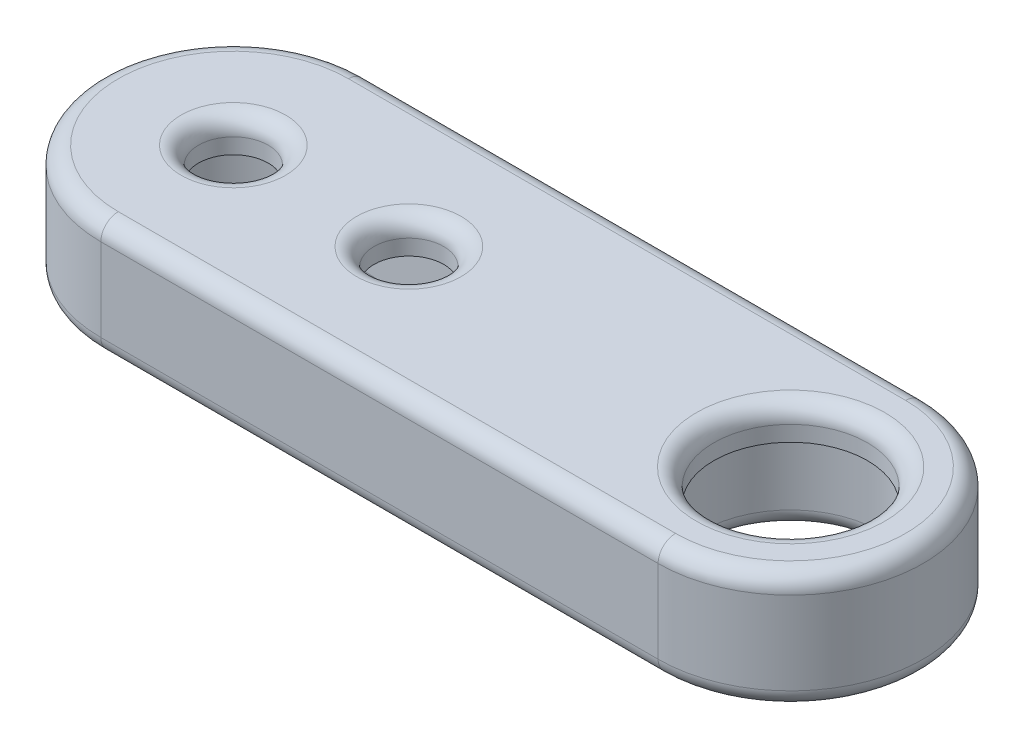
ISO-10303-21;
HEADER;
FILE_DESCRIPTION(('STEP AP214'),'2;1');
FILE_NAME('part.step','',(''),(''),'','','');
FILE_SCHEMA(('AUTOMOTIVE_DESIGN { 1 0 10303 214 1 1 1 1 }'));
ENDSEC;
DATA;
#1=APPLICATION_CONTEXT('core data for automotive mechanical design processes');
#2=APPLICATION_PROTOCOL_DEFINITION('international standard','automotive_design',2000,#1);
#3=PRODUCT_CONTEXT('',#1,'mechanical');
#4=PRODUCT('Part','Part','',(#3));
#5=PRODUCT_RELATED_PRODUCT_CATEGORY('part','',(#4));
#6=PRODUCT_DEFINITION_FORMATION('','',#4);
#7=PRODUCT_DEFINITION_CONTEXT('part definition',#1,'design');
#8=PRODUCT_DEFINITION('design','',#6,#7);
#9=PRODUCT_DEFINITION_SHAPE('','',#8);
#10=(LENGTH_UNIT() NAMED_UNIT(*) SI_UNIT(.MILLI.,.METRE.));
#11=(NAMED_UNIT(*) PLANE_ANGLE_UNIT() SI_UNIT($,.RADIAN.));
#12=(NAMED_UNIT(*) SI_UNIT($,.STERADIAN.) SOLID_ANGLE_UNIT());
#13=UNCERTAINTY_MEASURE_WITH_UNIT(LENGTH_MEASURE(1.E-05),#10,'distance_accuracy_value','');
#14=(GEOMETRIC_REPRESENTATION_CONTEXT(3) GLOBAL_UNCERTAINTY_ASSIGNED_CONTEXT((#13)) GLOBAL_UNIT_ASSIGNED_CONTEXT((#10,
#11,#12)) REPRESENTATION_CONTEXT('',''));
#15=CARTESIAN_POINT('',(0.,0.,0.));
#16=DIRECTION('',(0.,0.,1.));
#17=DIRECTION('',(1.,0.,0.));
#18=AXIS2_PLACEMENT_3D('',#15,#16,#17);
#19=CARTESIAN_POINT('',(0.,4.5,0.));
#20=DIRECTION('',(0.,-1.,0.));
#21=DIRECTION('',(0.,0.,-1.));
#22=AXIS2_PLACEMENT_3D('',#19,#20,#21);
#23=CYLINDRICAL_SURFACE('',#22,6.04);
#24=DIRECTION('',(0.,-1.,0.));
#25=VECTOR('',#24,1.);
#26=CARTESIAN_POINT('',(0.,4.5,6.04));
#27=LINE('',#26,#25);
#28=CARTESIAN_POINT('',(0.,5.20625,6.04));
#29=VERTEX_POINT('',#28);
#30=CARTESIAN_POINT('',(0.,1.42875,6.04));
#31=VERTEX_POINT('',#30);
#32=EDGE_CURVE('E188',#29,#31,#27,.T.);
#33=ORIENTED_EDGE('',*,*,#32,.F.);
#34=CARTESIAN_POINT('',(0.,5.20625,0.));
#35=DIRECTION('',(0.,-1.,0.));
#36=DIRECTION('',(0.,0.,-1.));
#37=AXIS2_PLACEMENT_3D('',#34,#35,#36);
#38=CIRCLE('',#37,6.04);
#39=CARTESIAN_POINT('',(0.,5.20625,-6.04));
#40=VERTEX_POINT('',#39);
#41=EDGE_CURVE('E58',#29,#40,#38,.T.);
#42=ORIENTED_EDGE('',*,*,#41,.T.);
#43=DIRECTION('',(0.,-1.,0.));
#44=VECTOR('',#43,1.);
#45=CARTESIAN_POINT('',(0.,4.5,-6.04));
#46=LINE('',#45,#44);
#47=CARTESIAN_POINT('',(0.,1.42875,-6.04));
#48=VERTEX_POINT('',#47);
#49=EDGE_CURVE('E175',#40,#48,#46,.T.);
#50=ORIENTED_EDGE('',*,*,#49,.T.);
#51=CARTESIAN_POINT('',(0.,1.42875,0.));
#52=DIRECTION('',(0.,-1.,0.));
#53=DIRECTION('',(0.,0.,-1.));
#54=AXIS2_PLACEMENT_3D('',#51,#52,#53);
#55=CIRCLE('',#54,6.04);
#56=EDGE_CURVE('E217',#48,#31,#55,.F.);
#57=ORIENTED_EDGE('',*,*,#56,.T.);
#58=EDGE_LOOP('',(#33,#42,#50,#57));
#59=FACE_BOUND('',#58,.T.);
#60=ADVANCED_FACE('F41',(#59),#23,.T.);
#61=CARTESIAN_POINT('',(0.,4.5,6.04));
#62=DIRECTION('',(0.,0.,-1.));
#63=DIRECTION('',(-1.,0.,0.));
#64=AXIS2_PLACEMENT_3D('',#61,#62,#63);
#65=PLANE('',#64);
#66=DIRECTION('',(0.,-1.,0.));
#67=VECTOR('',#66,1.);
#68=CARTESIAN_POINT('',(25.4,4.5,6.04));
#69=LINE('',#68,#67);
#70=CARTESIAN_POINT('',(25.4,5.20625,6.04));
#71=VERTEX_POINT('',#70);
#72=CARTESIAN_POINT('',(25.4,1.42875,6.04));
#73=VERTEX_POINT('',#72);
#74=EDGE_CURVE('E186',#71,#73,#69,.T.);
#75=ORIENTED_EDGE('',*,*,#74,.F.);
#76=DIRECTION('',(-1.,0.,0.));
#77=VECTOR('',#76,1.);
#78=CARTESIAN_POINT('',(0.,5.20625,6.04));
#79=LINE('',#78,#77);
#80=EDGE_CURVE('E66',#71,#29,#79,.T.);
#81=ORIENTED_EDGE('',*,*,#80,.T.);
#82=ORIENTED_EDGE('',*,*,#32,.T.);
#83=DIRECTION('',(-1.,0.,0.));
#84=VECTOR('',#83,1.);
#85=CARTESIAN_POINT('',(25.4,1.42875,6.04));
#86=LINE('',#85,#84);
#87=EDGE_CURVE('E220',#31,#73,#86,.F.);
#88=ORIENTED_EDGE('',*,*,#87,.T.);
#89=EDGE_LOOP('',(#75,#81,#82,#88));
#90=FACE_BOUND('',#89,.T.);
#91=ADVANCED_FACE('F315',(#90),#65,.F.);
#92=CARTESIAN_POINT('',(25.4,4.5,0.));
#93=DIRECTION('',(0.,-1.,0.));
#94=DIRECTION('',(0.,0.,-1.));
#95=AXIS2_PLACEMENT_3D('',#92,#93,#94);
#96=CYLINDRICAL_SURFACE('',#95,6.04);
#97=DIRECTION('',(0.,-1.,0.));
#98=VECTOR('',#97,1.);
#99=CARTESIAN_POINT('',(25.4,4.5,-6.04));
#100=LINE('',#99,#98);
#101=CARTESIAN_POINT('',(25.4,5.20625,-6.04));
#102=VERTEX_POINT('',#101);
#103=CARTESIAN_POINT('',(25.4,1.42875,-6.04));
#104=VERTEX_POINT('',#103);
#105=EDGE_CURVE('E178',#102,#104,#100,.T.);
#106=ORIENTED_EDGE('',*,*,#105,.F.);
#107=CARTESIAN_POINT('',(25.4,5.20625,0.));
#108=DIRECTION('',(0.,-1.,0.));
#109=DIRECTION('',(0.,0.,-1.));
#110=AXIS2_PLACEMENT_3D('',#107,#108,#109);
#111=CIRCLE('',#110,6.04);
#112=EDGE_CURVE('E239',#102,#71,#111,.T.);
#113=ORIENTED_EDGE('',*,*,#112,.T.);
#114=ORIENTED_EDGE('',*,*,#74,.T.);
#115=CARTESIAN_POINT('',(25.4,1.42875,0.));
#116=DIRECTION('',(0.,-1.,0.));
#117=DIRECTION('',(0.,0.,-1.));
#118=AXIS2_PLACEMENT_3D('',#115,#116,#117);
#119=CIRCLE('',#118,6.04);
#120=EDGE_CURVE('E224',#73,#104,#119,.F.);
#121=ORIENTED_EDGE('',*,*,#120,.T.);
#122=EDGE_LOOP('',(#106,#113,#114,#121));
#123=FACE_BOUND('',#122,.T.);
#124=ADVANCED_FACE('F320',(#123),#96,.T.);
#125=CARTESIAN_POINT('',(0.,4.5,-6.04));
#126=DIRECTION('',(0.,0.,1.));
#127=DIRECTION('',(1.,0.,0.));
#128=AXIS2_PLACEMENT_3D('',#125,#126,#127);
#129=PLANE('',#128);
#130=ORIENTED_EDGE('',*,*,#49,.F.);
#131=DIRECTION('',(1.,0.,0.));
#132=VECTOR('',#131,1.);
#133=CARTESIAN_POINT('',(0.,5.20625,-6.04));
#134=LINE('',#133,#132);
#135=EDGE_CURVE('E412',#40,#102,#134,.T.);
#136=ORIENTED_EDGE('',*,*,#135,.T.);
#137=ORIENTED_EDGE('',*,*,#105,.T.);
#138=DIRECTION('',(1.,0.,0.));
#139=VECTOR('',#138,1.);
#140=CARTESIAN_POINT('',(0.,1.42875,-6.04));
#141=LINE('',#140,#139);
#142=EDGE_CURVE('E214',#104,#48,#141,.F.);
#143=ORIENTED_EDGE('',*,*,#142,.T.);
#144=EDGE_LOOP('',(#130,#136,#137,#143));
#145=FACE_BOUND('',#144,.T.);
#146=ADVANCED_FACE('F453',(#145),#129,.F.);
#147=CARTESIAN_POINT('',(0.,4.5,0.));
#148=DIRECTION('',(0.,-1.,0.));
#149=DIRECTION('',(0.,0.,-1.));
#150=AXIS2_PLACEMENT_3D('',#147,#148,#149);
#151=CYLINDRICAL_SURFACE('',#150,3.5);
#152=DIRECTION('',(0.,-1.,0.));
#153=VECTOR('',#152,1.);
#154=CARTESIAN_POINT('',(2.28637267303474,4.5,2.65));
#155=LINE('',#154,#153);
#156=CARTESIAN_POINT('',(2.28637267303474,4.5,2.65));
#157=VERTEX_POINT('',#156);
#158=CARTESIAN_POINT('',(2.28637267303474,1.42875,2.65));
#159=VERTEX_POINT('',#158);
#160=EDGE_CURVE('E166',#157,#159,#155,.T.);
#161=ORIENTED_EDGE('',*,*,#160,.T.);
#162=CARTESIAN_POINT('',(0.,1.42875,0.));
#163=DIRECTION('',(0.,-1.,0.));
#164=DIRECTION('',(0.,0.,-1.));
#165=AXIS2_PLACEMENT_3D('',#162,#163,#164);
#166=CIRCLE('',#165,3.5);
#167=CARTESIAN_POINT('',(2.28637267303474,1.42875,-2.65));
#168=VERTEX_POINT('',#167);
#169=EDGE_CURVE('E230',#159,#168,#166,.T.);
#170=ORIENTED_EDGE('',*,*,#169,.T.);
#171=DIRECTION('',(0.,-1.,0.));
#172=VECTOR('',#171,1.);
#173=CARTESIAN_POINT('',(2.28637267303474,4.5,-2.65));
#174=LINE('',#173,#172);
#175=CARTESIAN_POINT('',(2.28637267303474,4.5,-2.65));
#176=VERTEX_POINT('',#175);
#177=EDGE_CURVE('E169',#176,#168,#174,.T.);
#178=ORIENTED_EDGE('',*,*,#177,.F.);
#179=CARTESIAN_POINT('',(0.,4.5,0.));
#180=DIRECTION('',(0.,1.,0.));
#181=DIRECTION('',(0.,0.,1.));
#182=AXIS2_PLACEMENT_3D('',#179,#180,#181);
#183=CIRCLE('',#182,3.5);
#184=EDGE_CURVE('E151',#176,#157,#183,.T.);
#185=ORIENTED_EDGE('',*,*,#184,.T.);
#186=EDGE_LOOP('',(#161,#170,#178,#185));
#187=FACE_BOUND('',#186,.T.);
#188=ADVANCED_FACE('F164',(#187),#151,.F.);
#189=CARTESIAN_POINT('',(2.28637267303474,4.5,2.65));
#190=DIRECTION('',(-0.0551466582265049,0.,-0.998478265204831));
#191=DIRECTION('',(-0.998478265204831,0.,0.0551466582265049));
#192=AXIS2_PLACEMENT_3D('',#189,#190,#191);
#193=PLANE('',#192);
#194=DIRECTION('',(0.,-1.,0.));
#195=VECTOR('',#194,1.);
#196=CARTESIAN_POINT('',(14.110293316453,4.5,1.99695653040966));
#197=LINE('',#196,#195);
#198=CARTESIAN_POINT('',(14.110293316453,4.5,1.99695653040966));
#199=VERTEX_POINT('',#198);
#200=CARTESIAN_POINT('',(14.110293316453,1.42875,1.99695653040966));
#201=VERTEX_POINT('',#200);
#202=EDGE_CURVE('E176',#199,#201,#197,.T.);
#203=ORIENTED_EDGE('',*,*,#202,.T.);
#204=DIRECTION('',(-0.998478265204831,0.,0.0551466582265049));
#205=VECTOR('',#204,1.);
#206=CARTESIAN_POINT('',(2.28637267303474,1.42875,2.65));
#207=LINE('',#206,#205);
#208=EDGE_CURVE('E174',#201,#159,#207,.T.);
#209=ORIENTED_EDGE('',*,*,#208,.T.);
#210=ORIENTED_EDGE('',*,*,#160,.F.);
#211=DIRECTION('',(0.998478265204831,0.,-0.0551466582265049));
#212=VECTOR('',#211,1.);
#213=CARTESIAN_POINT('',(2.28637267303474,4.5,2.65));
#214=LINE('',#213,#212);
#215=EDGE_CURVE('E148',#157,#199,#214,.T.);
#216=ORIENTED_EDGE('',*,*,#215,.T.);
#217=EDGE_LOOP('',(#203,#209,#210,#216));
#218=FACE_BOUND('',#217,.T.);
#219=ADVANCED_FACE('F172',(#218),#193,.T.);
#220=CARTESIAN_POINT('',(14.,4.5,0.));
#221=DIRECTION('',(0.,-1.,0.));
#222=DIRECTION('',(0.,0.,-1.));
#223=AXIS2_PLACEMENT_3D('',#220,#221,#222);
#224=CYLINDRICAL_SURFACE('',#223,2.);
#225=DIRECTION('',(0.,-1.,0.));
#226=VECTOR('',#225,1.);
#227=CARTESIAN_POINT('',(14.110293316453,4.5,-1.99695653040966));
#228=LINE('',#227,#226);
#229=CARTESIAN_POINT('',(14.110293316453,4.5,-1.99695653040966));
#230=VERTEX_POINT('',#229);
#231=CARTESIAN_POINT('',(14.110293316453,1.42875,-1.99695653040966));
#232=VERTEX_POINT('',#231);
#233=EDGE_CURVE('E181',#230,#232,#228,.T.);
#234=ORIENTED_EDGE('',*,*,#233,.T.);
#235=CARTESIAN_POINT('',(14.,1.42875,0.));
#236=DIRECTION('',(0.,-1.,0.));
#237=DIRECTION('',(0.,0.,-1.));
#238=AXIS2_PLACEMENT_3D('',#235,#236,#237);
#239=CIRCLE('',#238,2.);
#240=EDGE_CURVE('E234',#232,#201,#239,.T.);
#241=ORIENTED_EDGE('',*,*,#240,.T.);
#242=ORIENTED_EDGE('',*,*,#202,.F.);
#243=CARTESIAN_POINT('',(14.,4.5,0.));
#244=DIRECTION('',(0.,1.,0.));
#245=DIRECTION('',(0.,0.,-1.));
#246=AXIS2_PLACEMENT_3D('',#243,#244,#245);
#247=CIRCLE('',#246,2.);
#248=EDGE_CURVE('E154',#199,#230,#247,.T.);
#249=ORIENTED_EDGE('',*,*,#248,.T.);
#250=EDGE_LOOP('',(#234,#241,#242,#249));
#251=FACE_BOUND('',#250,.T.);
#252=ADVANCED_FACE('F373',(#251),#224,.F.);
#253=CARTESIAN_POINT('',(2.28637267303474,4.5,-2.65));
#254=DIRECTION('',(-0.0551466582265049,0.,0.998478265204831));
#255=DIRECTION('',(0.998478265204831,0.,0.0551466582265049));
#256=AXIS2_PLACEMENT_3D('',#253,#254,#255);
#257=PLANE('',#256);
#258=ORIENTED_EDGE('',*,*,#177,.T.);
#259=DIRECTION('',(0.998478265204831,0.,0.0551466582265049));
#260=VECTOR('',#259,1.);
#261=CARTESIAN_POINT('',(2.28637267303474,1.42875,-2.65));
#262=LINE('',#261,#260);
#263=EDGE_CURVE('E232',#168,#232,#262,.T.);
#264=ORIENTED_EDGE('',*,*,#263,.T.);
#265=ORIENTED_EDGE('',*,*,#233,.F.);
#266=DIRECTION('',(-0.998478265204831,0.,-0.0551466582265049));
#267=VECTOR('',#266,1.);
#268=CARTESIAN_POINT('',(2.28637267303474,4.5,-2.65));
#269=LINE('',#268,#267);
#270=EDGE_CURVE('E365',#230,#176,#269,.T.);
#271=ORIENTED_EDGE('',*,*,#270,.T.);
#272=EDGE_LOOP('',(#258,#264,#265,#271));
#273=FACE_BOUND('',#272,.T.);
#274=ADVANCED_FACE('F351',(#273),#257,.T.);
#275=CARTESIAN_POINT('',(25.4,4.5,0.));
#276=DIRECTION('',(0.,-1.,0.));
#277=DIRECTION('',(0.,0.,-1.));
#278=AXIS2_PLACEMENT_3D('',#275,#276,#277);
#279=CYLINDRICAL_SURFACE('',#278,4.064);
#280=CARTESIAN_POINT('',(25.4,1.42875,0.));
#281=DIRECTION('',(0.,-1.,0.));
#282=DIRECTION('',(0.,0.,-1.));
#283=AXIS2_PLACEMENT_3D('',#280,#281,#282);
#284=CIRCLE('',#283,4.064);
#285=CARTESIAN_POINT('',(25.4,1.42875,-4.064));
#286=VERTEX_POINT('',#285);
#287=EDGE_CURVE('E227',#286,#286,#284,.T.);
#288=ORIENTED_EDGE('',*,*,#287,.T.);
#289=EDGE_LOOP('',(#288));
#290=FACE_BOUND('',#289,.T.);
#291=CARTESIAN_POINT('',(25.4,4.5,0.));
#292=DIRECTION('',(0.,1.,0.));
#293=DIRECTION('',(0.,0.,1.));
#294=AXIS2_PLACEMENT_3D('',#291,#292,#293);
#295=CIRCLE('',#294,4.064);
#296=CARTESIAN_POINT('',(25.4,4.5,4.064));
#297=VERTEX_POINT('',#296);
#298=EDGE_CURVE('E170',#297,#297,#295,.T.);
#299=ORIENTED_EDGE('',*,*,#298,.T.);
#300=EDGE_LOOP('',(#299));
#301=FACE_BOUND('',#300,.T.);
#302=ADVANCED_FACE('F348',(#290,#301),#279,.F.);
#303=CARTESIAN_POINT('',(25.4,4.5,0.));
#304=DIRECTION('',(0.,1.,0.));
#305=DIRECTION('',(0.,0.,1.));
#306=AXIS2_PLACEMENT_3D('',#303,#304,#305);
#307=PLANE('',#306);
#308=CARTESIAN_POINT('',(8.,4.5,0.));
#309=DIRECTION('',(0.,1.,0.));
#310=DIRECTION('',(0.,0.,1.));
#311=AXIS2_PLACEMENT_3D('',#308,#309,#310);
#312=CIRCLE('',#311,1.5875);
#313=CARTESIAN_POINT('',(8.,4.5,1.5875));
#314=VERTEX_POINT('',#313);
#315=EDGE_CURVE('E356',#314,#314,#312,.T.);
#316=ORIENTED_EDGE('',*,*,#315,.T.);
#317=EDGE_LOOP('',(#316));
#318=FACE_BOUND('',#317,.T.);
#319=CARTESIAN_POINT('',(0.,4.5,0.));
#320=DIRECTION('',(0.,1.,0.));
#321=DIRECTION('',(0.,0.,1.));
#322=AXIS2_PLACEMENT_3D('',#319,#320,#321);
#323=CIRCLE('',#322,1.5875);
#324=CARTESIAN_POINT('',(0.,4.5,1.5875));
#325=VERTEX_POINT('',#324);
#326=EDGE_CURVE('E252',#325,#325,#323,.T.);
#327=ORIENTED_EDGE('',*,*,#326,.T.);
#328=EDGE_LOOP('',(#327));
#329=FACE_BOUND('',#328,.T.);
#330=ORIENTED_EDGE('',*,*,#184,.F.);
#331=ORIENTED_EDGE('',*,*,#270,.F.);
#332=ORIENTED_EDGE('',*,*,#248,.F.);
#333=ORIENTED_EDGE('',*,*,#215,.F.);
#334=EDGE_LOOP('',(#330,#331,#332,#333));
#335=FACE_BOUND('',#334,.T.);
#336=ADVANCED_FACE('F150',(#318,#329,#335),#307,.F.);
#337=CARTESIAN_POINT('',(25.4,4.5,0.));
#338=DIRECTION('',(0.,1.,0.));
#339=DIRECTION('',(0.,0.,1.));
#340=AXIS2_PLACEMENT_3D('',#337,#338,#339);
#341=CIRCLE('',#340,3.5);
#342=CARTESIAN_POINT('',(25.4,4.5,3.5));
#343=VERTEX_POINT('',#342);
#344=EDGE_CURVE('E359',#343,#343,#341,.T.);
#345=ORIENTED_EDGE('',*,*,#344,.T.);
#346=EDGE_LOOP('',(#345));
#347=FACE_BOUND('',#346,.T.);
#348=ORIENTED_EDGE('',*,*,#298,.F.);
#349=EDGE_LOOP('',(#348));
#350=FACE_BOUND('',#349,.T.);
#351=ADVANCED_FACE('F675',(#347,#350),#307,.F.);
#352=CARTESIAN_POINT('',(0.,51.3786338005777,0.));
#353=DIRECTION('',(0.,-1.,0.));
#354=DIRECTION('',(0.,0.,-1.));
#355=AXIS2_PLACEMENT_3D('',#352,#353,#354);
#356=CYLINDRICAL_SURFACE('',#355,1.5875);
#357=CARTESIAN_POINT('',(0.,5.20625,0.));
#358=DIRECTION('',(0.,-1.,0.));
#359=DIRECTION('',(0.,0.,-1.));
#360=AXIS2_PLACEMENT_3D('',#357,#358,#359);
#361=CIRCLE('',#360,1.5875);
#362=CARTESIAN_POINT('',(0.,5.20625,-1.5875));
#363=VERTEX_POINT('',#362);
#364=EDGE_CURVE('E415',#363,#363,#361,.F.);
#365=ORIENTED_EDGE('',*,*,#364,.T.);
#366=EDGE_LOOP('',(#365));
#367=FACE_BOUND('',#366,.T.);
#368=ORIENTED_EDGE('',*,*,#326,.F.);
#369=EDGE_LOOP('',(#368));
#370=FACE_BOUND('',#369,.T.);
#371=ADVANCED_FACE('F666',(#367,#370),#356,.F.);
#372=CARTESIAN_POINT('',(25.4,51.3786338005777,0.));
#373=DIRECTION('',(0.,-1.,0.));
#374=DIRECTION('',(0.,0.,-1.));
#375=AXIS2_PLACEMENT_3D('',#372,#373,#374);
#376=CYLINDRICAL_SURFACE('',#375,3.5);
#377=CARTESIAN_POINT('',(25.4,5.20625,0.));
#378=DIRECTION('',(0.,-1.,0.));
#379=DIRECTION('',(0.,0.,-1.));
#380=AXIS2_PLACEMENT_3D('',#377,#378,#379);
#381=CIRCLE('',#380,3.5);
#382=CARTESIAN_POINT('',(25.4,5.20625,-3.5));
#383=VERTEX_POINT('',#382);
#384=EDGE_CURVE('E50',#383,#383,#381,.F.);
#385=ORIENTED_EDGE('',*,*,#384,.T.);
#386=EDGE_LOOP('',(#385));
#387=FACE_BOUND('',#386,.T.);
#388=ORIENTED_EDGE('',*,*,#344,.F.);
#389=EDGE_LOOP('',(#388));
#390=FACE_BOUND('',#389,.T.);
#391=ADVANCED_FACE('F657',(#387,#390),#376,.F.);
#392=CARTESIAN_POINT('',(8.,51.3786338005777,0.));
#393=DIRECTION('',(0.,-1.,0.));
#394=DIRECTION('',(0.,0.,-1.));
#395=AXIS2_PLACEMENT_3D('',#392,#393,#394);
#396=CYLINDRICAL_SURFACE('',#395,1.5875);
#397=CARTESIAN_POINT('',(8.,5.20625,0.));
#398=DIRECTION('',(0.,-1.,0.));
#399=DIRECTION('',(0.,0.,-1.));
#400=AXIS2_PLACEMENT_3D('',#397,#398,#399);
#401=CIRCLE('',#400,1.5875);
#402=CARTESIAN_POINT('',(8.,5.20625,-1.5875));
#403=VERTEX_POINT('',#402);
#404=EDGE_CURVE('E12',#403,#403,#401,.F.);
#405=ORIENTED_EDGE('',*,*,#404,.T.);
#406=EDGE_LOOP('',(#405));
#407=FACE_BOUND('',#406,.T.);
#408=ORIENTED_EDGE('',*,*,#315,.F.);
#409=EDGE_LOOP('',(#408));
#410=FACE_BOUND('',#409,.T.);
#411=ADVANCED_FACE('F650',(#407,#410),#396,.F.);
#412=CARTESIAN_POINT('',(0.,6.,0.));
#413=DIRECTION('',(0.,-1.,0.));
#414=DIRECTION('',(0.,0.,-1.));
#415=AXIS2_PLACEMENT_3D('',#412,#413,#414);
#416=PLANE('',#415);
#417=DIRECTION('',(-1.,0.,0.));
#418=VECTOR('',#417,1.);
#419=CARTESIAN_POINT('',(0.,6.,5.24625));
#420=LINE('',#419,#418);
#421=CARTESIAN_POINT('',(0.,6.,5.24625));
#422=VERTEX_POINT('',#421);
#423=CARTESIAN_POINT('',(25.4,6.,5.24625));
#424=VERTEX_POINT('',#423);
#425=EDGE_CURVE('E404',#422,#424,#420,.F.);
#426=ORIENTED_EDGE('',*,*,#425,.T.);
#427=CARTESIAN_POINT('',(25.4,6.,0.));
#428=DIRECTION('',(0.,-1.,0.));
#429=DIRECTION('',(0.,0.,-1.));
#430=AXIS2_PLACEMENT_3D('',#427,#428,#429);
#431=CIRCLE('',#430,5.24625);
#432=CARTESIAN_POINT('',(25.4,6.,-5.24625));
#433=VERTEX_POINT('',#432);
#434=EDGE_CURVE('E407',#424,#433,#431,.F.);
#435=ORIENTED_EDGE('',*,*,#434,.T.);
#436=DIRECTION('',(1.,0.,0.));
#437=VECTOR('',#436,1.);
#438=CARTESIAN_POINT('',(0.,6.,-5.24625));
#439=LINE('',#438,#437);
#440=CARTESIAN_POINT('',(0.,6.,-5.24625));
#441=VERTEX_POINT('',#440);
#442=EDGE_CURVE('E399',#433,#441,#439,.F.);
#443=ORIENTED_EDGE('',*,*,#442,.T.);
#444=CARTESIAN_POINT('',(0.,6.,0.));
#445=DIRECTION('',(0.,-1.,0.));
#446=DIRECTION('',(0.,0.,-1.));
#447=AXIS2_PLACEMENT_3D('',#444,#445,#446);
#448=CIRCLE('',#447,5.24625);
#449=EDGE_CURVE('E402',#441,#422,#448,.F.);
#450=ORIENTED_EDGE('',*,*,#449,.T.);
#451=EDGE_LOOP('',(#426,#435,#443,#450));
#452=FACE_BOUND('',#451,.T.);
#453=CARTESIAN_POINT('',(0.,6.,0.));
#454=DIRECTION('',(0.,-1.,0.));
#455=DIRECTION('',(0.,0.,-1.));
#456=AXIS2_PLACEMENT_3D('',#453,#454,#455);
#457=CIRCLE('',#456,2.38125);
#458=CARTESIAN_POINT('',(0.,6.,-2.38125));
#459=VERTEX_POINT('',#458);
#460=EDGE_CURVE('E396',#459,#459,#457,.T.);
#461=ORIENTED_EDGE('',*,*,#460,.T.);
#462=EDGE_LOOP('',(#461));
#463=FACE_BOUND('',#462,.T.);
#464=CARTESIAN_POINT('',(25.4,6.,0.));
#465=DIRECTION('',(0.,-1.,0.));
#466=DIRECTION('',(0.,0.,-1.));
#467=AXIS2_PLACEMENT_3D('',#464,#465,#466);
#468=CIRCLE('',#467,4.29375);
#469=CARTESIAN_POINT('',(25.4,6.,-4.29375));
#470=VERTEX_POINT('',#469);
#471=EDGE_CURVE('E393',#470,#470,#468,.T.);
#472=ORIENTED_EDGE('',*,*,#471,.T.);
#473=EDGE_LOOP('',(#472));
#474=FACE_BOUND('',#473,.T.);
#475=CARTESIAN_POINT('',(8.,6.,0.));
#476=DIRECTION('',(0.,-1.,0.));
#477=DIRECTION('',(0.,0.,-1.));
#478=AXIS2_PLACEMENT_3D('',#475,#476,#477);
#479=CIRCLE('',#478,2.38125);
#480=CARTESIAN_POINT('',(8.,6.,-2.38125));
#481=VERTEX_POINT('',#480);
#482=EDGE_CURVE('E390',#481,#481,#479,.T.);
#483=ORIENTED_EDGE('',*,*,#482,.T.);
#484=EDGE_LOOP('',(#483));
#485=FACE_BOUND('',#484,.T.);
#486=ADVANCED_FACE('F434',(#452,#463,#474,#485),#416,.F.);
#487=CARTESIAN_POINT('',(25.4,0.635,0.));
#488=DIRECTION('',(0.,-1.,0.));
#489=DIRECTION('',(0.,0.,-1.));
#490=AXIS2_PLACEMENT_3D('',#487,#488,#489);
#491=PLANE('',#490);
#492=CARTESIAN_POINT('',(0.,0.635,0.));
#493=DIRECTION('',(0.,-1.,0.));
#494=DIRECTION('',(0.,0.,-1.));
#495=AXIS2_PLACEMENT_3D('',#492,#493,#494);
#496=CIRCLE('',#495,5.24625);
#497=CARTESIAN_POINT('',(0.,0.635,5.24625));
#498=VERTEX_POINT('',#497);
#499=CARTESIAN_POINT('',(0.,0.635,-5.24625));
#500=VERTEX_POINT('',#499);
#501=EDGE_CURVE('E209',#498,#500,#496,.T.);
#502=ORIENTED_EDGE('',*,*,#501,.T.);
#503=DIRECTION('',(1.,0.,0.));
#504=VECTOR('',#503,1.);
#505=CARTESIAN_POINT('',(25.4,0.635,-5.24625));
#506=LINE('',#505,#504);
#507=CARTESIAN_POINT('',(25.4,0.635,-5.24625));
#508=VERTEX_POINT('',#507);
#509=EDGE_CURVE('E211',#500,#508,#506,.T.);
#510=ORIENTED_EDGE('',*,*,#509,.T.);
#511=CARTESIAN_POINT('',(25.4,0.635,0.));
#512=DIRECTION('',(0.,-1.,0.));
#513=DIRECTION('',(0.,0.,-1.));
#514=AXIS2_PLACEMENT_3D('',#511,#512,#513);
#515=CIRCLE('',#514,5.24625);
#516=CARTESIAN_POINT('',(25.4,0.635,5.24625));
#517=VERTEX_POINT('',#516);
#518=EDGE_CURVE('E204',#508,#517,#515,.T.);
#519=ORIENTED_EDGE('',*,*,#518,.T.);
#520=DIRECTION('',(-1.,0.,0.));
#521=VECTOR('',#520,1.);
#522=CARTESIAN_POINT('',(0.,0.635,5.24625));
#523=LINE('',#522,#521);
#524=EDGE_CURVE('E206',#517,#498,#523,.T.);
#525=ORIENTED_EDGE('',*,*,#524,.T.);
#526=EDGE_LOOP('',(#502,#510,#519,#525));
#527=FACE_BOUND('',#526,.T.);
#528=CARTESIAN_POINT('',(25.4,0.635,0.));
#529=DIRECTION('',(0.,-1.,0.));
#530=DIRECTION('',(0.,0.,-1.));
#531=AXIS2_PLACEMENT_3D('',#528,#529,#530);
#532=CIRCLE('',#531,4.85775);
#533=CARTESIAN_POINT('',(25.4,0.635,-4.85775));
#534=VERTEX_POINT('',#533);
#535=EDGE_CURVE('E201',#534,#534,#532,.F.);
#536=ORIENTED_EDGE('',*,*,#535,.T.);
#537=EDGE_LOOP('',(#536));
#538=FACE_BOUND('',#537,.T.);
#539=DIRECTION('',(0.998478265204831,0.,0.0551466582265049));
#540=VECTOR('',#539,1.);
#541=CARTESIAN_POINT('',(25.5193968218058,0.635,-2.16178342154457));
#542=LINE('',#541,#540);
#543=CARTESIAN_POINT('',(14.1540659764203,0.635,-2.789498653416));
#544=VERTEX_POINT('',#543);
#545=CARTESIAN_POINT('',(2.58493378599355,0.635,-3.42846997719523));
#546=VERTEX_POINT('',#545);
#547=EDGE_CURVE('E196',#544,#546,#542,.F.);
#548=ORIENTED_EDGE('',*,*,#547,.T.);
#549=CARTESIAN_POINT('',(0.,0.635,0.));
#550=DIRECTION('',(0.,-1.,0.));
#551=DIRECTION('',(0.,0.,-1.));
#552=AXIS2_PLACEMENT_3D('',#549,#550,#551);
#553=CIRCLE('',#552,4.29375);
#554=CARTESIAN_POINT('',(2.58493378599355,0.635,3.42846997719523));
#555=VERTEX_POINT('',#554);
#556=EDGE_CURVE('E198',#546,#555,#553,.F.);
#557=ORIENTED_EDGE('',*,*,#556,.T.);
#558=DIRECTION('',(-0.998478265204831,0.,0.0551466582265049));
#559=VECTOR('',#558,1.);
#560=CARTESIAN_POINT('',(25.5193968218058,0.635,2.16178342154457));
#561=LINE('',#560,#559);
#562=CARTESIAN_POINT('',(14.1540659764203,0.635,2.789498653416));
#563=VERTEX_POINT('',#562);
#564=EDGE_CURVE('E190',#555,#563,#561,.F.);
#565=ORIENTED_EDGE('',*,*,#564,.T.);
#566=CARTESIAN_POINT('',(14.,0.635,0.));
#567=DIRECTION('',(0.,-1.,0.));
#568=DIRECTION('',(0.,0.,-1.));
#569=AXIS2_PLACEMENT_3D('',#566,#567,#568);
#570=CIRCLE('',#569,2.79375);
#571=EDGE_CURVE('E193',#563,#544,#570,.F.);
#572=ORIENTED_EDGE('',*,*,#571,.T.);
#573=EDGE_LOOP('',(#548,#557,#565,#572));
#574=FACE_BOUND('',#573,.T.);
#575=ADVANCED_FACE('F338',(#527,#538,#574),#491,.T.);
#576=CARTESIAN_POINT('',(25.4,1.42875,5.24625));
#577=DIRECTION('',(1.,0.,0.));
#578=DIRECTION('',(0.,0.,-1.));
#579=AXIS2_PLACEMENT_3D('',#576,#577,#578);
#580=CYLINDRICAL_SURFACE('',#579,0.79375);
#581=CARTESIAN_POINT('',(25.4,1.42875,5.24625));
#582=DIRECTION('',(1.,0.,0.));
#583=DIRECTION('',(0.,0.,-1.));
#584=AXIS2_PLACEMENT_3D('',#581,#582,#583);
#585=CIRCLE('',#584,0.79375);
#586=EDGE_CURVE('E246',#73,#517,#585,.T.);
#587=ORIENTED_EDGE('',*,*,#586,.F.);
#588=ORIENTED_EDGE('',*,*,#87,.F.);
#589=CARTESIAN_POINT('',(0.,1.42875,5.24625));
#590=DIRECTION('',(-1.,0.,0.));
#591=DIRECTION('',(0.,0.,1.));
#592=AXIS2_PLACEMENT_3D('',#589,#590,#591);
#593=CIRCLE('',#592,0.79375);
#594=EDGE_CURVE('E249',#498,#31,#593,.T.);
#595=ORIENTED_EDGE('',*,*,#594,.F.);
#596=ORIENTED_EDGE('',*,*,#524,.F.);
#597=EDGE_LOOP('',(#587,#588,#595,#596));
#598=FACE_BOUND('',#597,.T.);
#599=ADVANCED_FACE('F335',(#598),#580,.T.);
#600=CARTESIAN_POINT('',(0.,1.42875,0.));
#601=DIRECTION('',(0.,-1.,0.));
#602=DIRECTION('',(0.,0.,-1.));
#603=AXIS2_PLACEMENT_3D('',#600,#601,#602);
#604=TOROIDAL_SURFACE('',#603,5.24625,0.79375);
#605=ORIENTED_EDGE('',*,*,#594,.T.);
#606=ORIENTED_EDGE('',*,*,#56,.F.);
#607=CARTESIAN_POINT('',(0.,1.42875,-5.24625));
#608=DIRECTION('',(1.,0.,0.));
#609=DIRECTION('',(0.,0.,-1.));
#610=AXIS2_PLACEMENT_3D('',#607,#608,#609);
#611=CIRCLE('',#610,0.79375);
#612=EDGE_CURVE('E242',#500,#48,#611,.T.);
#613=ORIENTED_EDGE('',*,*,#612,.F.);
#614=ORIENTED_EDGE('',*,*,#501,.F.);
#615=EDGE_LOOP('',(#605,#606,#613,#614));
#616=FACE_BOUND('',#615,.T.);
#617=ADVANCED_FACE('F331',(#616),#604,.T.);
#618=CARTESIAN_POINT('',(25.4,1.42875,0.));
#619=DIRECTION('',(0.,-1.,0.));
#620=DIRECTION('',(0.,0.,-1.));
#621=AXIS2_PLACEMENT_3D('',#618,#619,#620);
#622=TOROIDAL_SURFACE('',#621,5.24625,0.79375);
#623=ORIENTED_EDGE('',*,*,#586,.T.);
#624=ORIENTED_EDGE('',*,*,#518,.F.);
#625=CARTESIAN_POINT('',(25.4,1.42875,-5.24625));
#626=DIRECTION('',(-1.,0.,0.));
#627=DIRECTION('',(0.,0.,1.));
#628=AXIS2_PLACEMENT_3D('',#625,#626,#627);
#629=CIRCLE('',#628,0.79375);
#630=EDGE_CURVE('E240',#104,#508,#629,.T.);
#631=ORIENTED_EDGE('',*,*,#630,.F.);
#632=ORIENTED_EDGE('',*,*,#120,.F.);
#633=EDGE_LOOP('',(#623,#624,#631,#632));
#634=FACE_BOUND('',#633,.T.);
#635=ADVANCED_FACE('F327',(#634),#622,.T.);
#636=CARTESIAN_POINT('',(25.4,1.42875,-5.24625));
#637=DIRECTION('',(-1.,0.,0.));
#638=DIRECTION('',(0.,0.,1.));
#639=AXIS2_PLACEMENT_3D('',#636,#637,#638);
#640=CYLINDRICAL_SURFACE('',#639,0.79375);
#641=ORIENTED_EDGE('',*,*,#612,.T.);
#642=ORIENTED_EDGE('',*,*,#142,.F.);
#643=ORIENTED_EDGE('',*,*,#630,.T.);
#644=ORIENTED_EDGE('',*,*,#509,.F.);
#645=EDGE_LOOP('',(#641,#642,#643,#644));
#646=FACE_BOUND('',#645,.T.);
#647=ADVANCED_FACE('F324',(#646),#640,.T.);
#648=CARTESIAN_POINT('',(25.4,1.42875,0.));
#649=DIRECTION('',(0.,-1.,0.));
#650=DIRECTION('',(0.,0.,-1.));
#651=AXIS2_PLACEMENT_3D('',#648,#649,#650);
#652=TOROIDAL_SURFACE('',#651,4.85775,0.79375);
#653=ORIENTED_EDGE('',*,*,#535,.F.);
#654=EDGE_LOOP('',(#653));
#655=FACE_BOUND('',#654,.T.);
#656=ORIENTED_EDGE('',*,*,#287,.F.);
#657=EDGE_LOOP('',(#656));
#658=FACE_BOUND('',#657,.T.);
#659=ADVANCED_FACE('F285',(#655,#658),#652,.T.);
#660=CARTESIAN_POINT('',(14.,1.42875,0.));
#661=DIRECTION('',(0.,-1.,0.));
#662=DIRECTION('',(0.,0.,-1.));
#663=AXIS2_PLACEMENT_3D('',#660,#661,#662);
#664=TOROIDAL_SURFACE('',#663,2.79375,0.79375);
#665=CARTESIAN_POINT('',(14.1540659764203,1.42875,-2.789498653416));
#666=DIRECTION('',(-0.998478265204831,0.,-0.055146658226505));
#667=DIRECTION('',(-0.055146658226505,0.,0.998478265204831));
#668=AXIS2_PLACEMENT_3D('',#665,#666,#667);
#669=CIRCLE('',#668,0.79375);
#670=EDGE_CURVE('E379',#544,#232,#669,.T.);
#671=ORIENTED_EDGE('',*,*,#670,.F.);
#672=ORIENTED_EDGE('',*,*,#571,.F.);
#673=CARTESIAN_POINT('',(14.1540659764203,1.42875,2.789498653416));
#674=DIRECTION('',(-0.998478265204831,0.,0.055146658226505));
#675=DIRECTION('',(0.055146658226505,0.,0.998478265204831));
#676=AXIS2_PLACEMENT_3D('',#673,#674,#675);
#677=CIRCLE('',#676,0.79375);
#678=EDGE_CURVE('E243',#201,#563,#677,.T.);
#679=ORIENTED_EDGE('',*,*,#678,.F.);
#680=ORIENTED_EDGE('',*,*,#240,.F.);
#681=EDGE_LOOP('',(#671,#672,#679,#680));
#682=FACE_BOUND('',#681,.T.);
#683=ADVANCED_FACE('F281',(#682),#664,.T.);
#684=CARTESIAN_POINT('',(2.33014533300202,1.42875,3.44254212300633));
#685=DIRECTION('',(-0.998478265204831,0.,0.0551466582265049));
#686=DIRECTION('',(0.0551466582265049,0.,0.998478265204831));
#687=AXIS2_PLACEMENT_3D('',#684,#685,#686);
#688=CYLINDRICAL_SURFACE('',#687,0.79375);
#689=ORIENTED_EDGE('',*,*,#678,.T.);
#690=ORIENTED_EDGE('',*,*,#564,.F.);
#691=CARTESIAN_POINT('',(2.28637267303474,1.42875,2.65));
#692=CARTESIAN_POINT('',(2.28637228616272,1.40725184022616,2.64999955774489));
#693=CARTESIAN_POINT('',(2.28671818616901,1.38576433603973,2.65085623576046));
#694=CARTESIAN_POINT('',(2.28809520834278,1.34295050596914,2.65426995849144));
#695=CARTESIAN_POINT('',(2.28912621572453,1.32162415369017,2.6568267183681));
#696=CARTESIAN_POINT('',(2.29322747226394,1.25821835044313,2.66700546000881));
#697=CARTESIAN_POINT('',(2.29730605799144,1.21657585455148,2.67713610596712));
#698=CARTESIAN_POINT('',(2.30797120951821,1.13573723747756,2.70372033903129));
#699=CARTESIAN_POINT('',(2.31455751729719,1.09654086509564,2.72017327563637));
#700=CARTESIAN_POINT('',(2.32996425560527,1.02157230200507,2.75884079185468));
#701=CARTESIAN_POINT('',(2.33878522331563,0.985800937473863,2.78105675685088));
#702=CARTESIAN_POINT('',(2.35856162427975,0.917736674358738,2.83114467138439));
#703=CARTESIAN_POINT('',(2.36956321507609,0.88554789741669,2.85913959832291));
#704=CARTESIAN_POINT('',(2.39317163859549,0.826377840671565,2.91960487622751));
#705=CARTESIAN_POINT('',(2.40577903562126,0.799398399927979,2.95207680080542));
#706=CARTESIAN_POINT('',(2.43285818666446,0.750010167473113,3.02231013648478));
#707=CARTESIAN_POINT('',(2.44739144712914,0.727895051870785,3.06025419043166));
#708=CARTESIAN_POINT('',(2.47734122259483,0.690492179409668,3.13904616932642));
#709=CARTESIAN_POINT('',(2.49275765324019,0.675203771723275,3.17989381702815));
#710=CARTESIAN_POINT('',(2.52058582142757,0.654348368638742,3.25419268999926));
#711=CARTESIAN_POINT('',(2.53291215408252,0.647382398035457,3.2872933123643));
#712=CARTESIAN_POINT('',(2.55762830607211,0.637885075417828,3.35405452570698));
#713=CARTESIAN_POINT('',(2.57001795901341,0.635345272075083,3.38771392535933));
#714=CARTESIAN_POINT('',(2.58320488052409,0.635010925886069,3.42374340426856));
#715=CARTESIAN_POINT('',(2.58406951928753,0.634999970984742,3.42610672656928));
#716=CARTESIAN_POINT('',(2.58493378599355,0.635,3.42846997719523));
#717=B_SPLINE_CURVE_WITH_KNOTS('',3,(#691,#692,#693,#694,#695,#696,#697,#698,#699,#700,#701,
#702,#703,#704,#705,#706,#707,#708,#709,#710,#711,#712,#713,#714,#715,#716),.UNSPECIFIED.,.F.,
.F.,(4,2,2,2,2,2,2,2,2,2,2,2,4),(0.,0.0644536629666132,0.128896529819953,0.257378723950158,
0.385847702079268,0.514347591722212,0.645932323387251,0.777563424005053,0.915734288850371,
1.05389197829352,1.16164466357764,1.26919137942156,1.27674091065004),.UNSPECIFIED.);
#718=EDGE_CURVE('E261',#159,#555,#717,.T.);
#719=ORIENTED_EDGE('',*,*,#718,.F.);
#720=ORIENTED_EDGE('',*,*,#208,.F.);
#721=EDGE_LOOP('',(#689,#690,#719,#720));
#722=FACE_BOUND('',#721,.T.);
#723=ADVANCED_FACE('F276',(#722),#688,.T.);
#724=CARTESIAN_POINT('',(2.33014533300202,1.42875,-3.44254212300633));
#725=DIRECTION('',(0.998478265204831,0.,0.0551466582265049));
#726=DIRECTION('',(0.0551466582265049,0.,-0.998478265204831));
#727=AXIS2_PLACEMENT_3D('',#724,#725,#726);
#728=CYLINDRICAL_SURFACE('',#727,0.79375);
#729=ORIENTED_EDGE('',*,*,#670,.T.);
#730=ORIENTED_EDGE('',*,*,#263,.F.);
#731=CARTESIAN_POINT('',(2.28637267303474,1.42875,-2.65));
#732=CARTESIAN_POINT('',(2.28637228616272,1.40725184022616,-2.64999955774489));
#733=CARTESIAN_POINT('',(2.28671818616901,1.38576433603973,-2.65085623576046));
#734=CARTESIAN_POINT('',(2.28809520834278,1.34295050596914,-2.65426995849144));
#735=CARTESIAN_POINT('',(2.28912621572453,1.32162415369017,-2.6568267183681));
#736=CARTESIAN_POINT('',(2.29322747226394,1.25821835044313,-2.66700546000881));
#737=CARTESIAN_POINT('',(2.29730605799144,1.21657585455148,-2.67713610596712));
#738=CARTESIAN_POINT('',(2.30797120951821,1.13573723747756,-2.70372033903129));
#739=CARTESIAN_POINT('',(2.31455751729719,1.09654086509564,-2.72017327563637));
#740=CARTESIAN_POINT('',(2.32996425560527,1.02157230200507,-2.75884079185468));
#741=CARTESIAN_POINT('',(2.33878522331563,0.985800937473863,-2.78105675685088));
#742=CARTESIAN_POINT('',(2.35856162427975,0.917736674358738,-2.83114467138439));
#743=CARTESIAN_POINT('',(2.36956321507609,0.88554789741669,-2.85913959832291));
#744=CARTESIAN_POINT('',(2.39317163859549,0.826377840671565,-2.91960487622751));
#745=CARTESIAN_POINT('',(2.40577903562126,0.799398399927979,-2.95207680080542));
#746=CARTESIAN_POINT('',(2.43285818666446,0.750010167473113,-3.02231013648478));
#747=CARTESIAN_POINT('',(2.44739144712914,0.727895051870785,-3.06025419043166));
#748=CARTESIAN_POINT('',(2.47734122259483,0.690492179409668,-3.13904616932642));
#749=CARTESIAN_POINT('',(2.49275765324019,0.675203771723275,-3.17989381702815));
#750=CARTESIAN_POINT('',(2.52058582142757,0.654348368638742,-3.25419268999926));
#751=CARTESIAN_POINT('',(2.53291215408252,0.647382398035457,-3.2872933123643));
#752=CARTESIAN_POINT('',(2.55762830607211,0.637885075417828,-3.35405452570698));
#753=CARTESIAN_POINT('',(2.57001795901341,0.635345272075083,-3.38771392535933));
#754=CARTESIAN_POINT('',(2.58320488052409,0.635010925886069,-3.42374340426856));
#755=CARTESIAN_POINT('',(2.58406951928753,0.634999970984742,-3.42610672656928));
#756=CARTESIAN_POINT('',(2.58493378599355,0.635,-3.42846997719523));
#757=B_SPLINE_CURVE_WITH_KNOTS('',3,(#731,#732,#733,#734,#735,#736,#737,#738,#739,#740,#741,
#742,#743,#744,#745,#746,#747,#748,#749,#750,#751,#752,#753,#754,#755,#756),.UNSPECIFIED.,.F.,
.F.,(4,2,2,2,2,2,2,2,2,2,2,2,4),(0.,0.0644536629666132,0.128896529819953,0.257378723950158,
0.385847702079268,0.514347591722212,0.645932323387251,0.777563424005053,0.915734288850371,
1.05389197829352,1.16164466357765,1.26919137942156,1.27674091065004),.UNSPECIFIED.);
#758=EDGE_CURVE('E253',#546,#168,#757,.F.);
#759=ORIENTED_EDGE('',*,*,#758,.F.);
#760=ORIENTED_EDGE('',*,*,#547,.F.);
#761=EDGE_LOOP('',(#729,#730,#759,#760));
#762=FACE_BOUND('',#761,.T.);
#763=ADVANCED_FACE('F268',(#762),#728,.T.);
#764=CARTESIAN_POINT('',(0.,1.42875,0.));
#765=DIRECTION('',(0.,-1.,0.));
#766=DIRECTION('',(0.,0.,-1.));
#767=AXIS2_PLACEMENT_3D('',#764,#765,#766);
#768=TOROIDAL_SURFACE('',#767,4.29375,0.79375);
#769=ORIENTED_EDGE('',*,*,#718,.T.);
#770=ORIENTED_EDGE('',*,*,#556,.F.);
#771=ORIENTED_EDGE('',*,*,#758,.T.);
#772=ORIENTED_EDGE('',*,*,#169,.F.);
#773=EDGE_LOOP('',(#769,#770,#771,#772));
#774=FACE_BOUND('',#773,.T.);
#775=ADVANCED_FACE('F271',(#774),#768,.T.);
#776=CARTESIAN_POINT('',(0.,5.20625,0.));
#777=DIRECTION('',(0.,-1.,0.));
#778=DIRECTION('',(0.,0.,-1.));
#779=AXIS2_PLACEMENT_3D('',#776,#777,#778);
#780=TOROIDAL_SURFACE('',#779,5.24625,0.79375);
#781=CARTESIAN_POINT('',(0.,5.20625,5.24625));
#782=DIRECTION('',(1.,0.,0.));
#783=DIRECTION('',(0.,0.,-1.));
#784=AXIS2_PLACEMENT_3D('',#781,#782,#783);
#785=CIRCLE('',#784,0.79375);
#786=EDGE_CURVE('E423',#422,#29,#785,.T.);
#787=ORIENTED_EDGE('',*,*,#786,.F.);
#788=ORIENTED_EDGE('',*,*,#449,.F.);
#789=CARTESIAN_POINT('',(0.,5.20625,-5.24625));
#790=DIRECTION('',(1.,0.,0.));
#791=DIRECTION('',(0.,0.,-1.));
#792=AXIS2_PLACEMENT_3D('',#789,#790,#791);
#793=CIRCLE('',#792,0.79375);
#794=EDGE_CURVE('E45',#40,#441,#793,.T.);
#795=ORIENTED_EDGE('',*,*,#794,.F.);
#796=ORIENTED_EDGE('',*,*,#41,.F.);
#797=EDGE_LOOP('',(#787,#788,#795,#796));
#798=FACE_BOUND('',#797,.T.);
#799=ADVANCED_FACE('F274',(#798),#780,.T.);
#800=CARTESIAN_POINT('',(0.,5.20625,-5.24625));
#801=DIRECTION('',(1.,0.,0.));
#802=DIRECTION('',(0.,0.,-1.));
#803=AXIS2_PLACEMENT_3D('',#800,#801,#802);
#804=CYLINDRICAL_SURFACE('',#803,0.79375);
#805=ORIENTED_EDGE('',*,*,#794,.T.);
#806=ORIENTED_EDGE('',*,*,#442,.F.);
#807=CARTESIAN_POINT('',(25.4,5.20625,-5.24625));
#808=DIRECTION('',(1.,0.,0.));
#809=DIRECTION('',(0.,0.,-1.));
#810=AXIS2_PLACEMENT_3D('',#807,#808,#809);
#811=CIRCLE('',#810,0.79375);
#812=EDGE_CURVE('E422',#102,#433,#811,.T.);
#813=ORIENTED_EDGE('',*,*,#812,.F.);
#814=ORIENTED_EDGE('',*,*,#135,.F.);
#815=EDGE_LOOP('',(#805,#806,#813,#814));
#816=FACE_BOUND('',#815,.T.);
#817=ADVANCED_FACE('F295',(#816),#804,.T.);
#818=CARTESIAN_POINT('',(0.,5.20625,5.24625));
#819=DIRECTION('',(-1.,0.,0.));
#820=DIRECTION('',(0.,0.,1.));
#821=AXIS2_PLACEMENT_3D('',#818,#819,#820);
#822=CYLINDRICAL_SURFACE('',#821,0.79375);
#823=ORIENTED_EDGE('',*,*,#786,.T.);
#824=ORIENTED_EDGE('',*,*,#80,.F.);
#825=CARTESIAN_POINT('',(25.4,5.20625,5.24625));
#826=DIRECTION('',(1.,0.,0.));
#827=DIRECTION('',(0.,0.,-1.));
#828=AXIS2_PLACEMENT_3D('',#825,#826,#827);
#829=CIRCLE('',#828,0.79375);
#830=EDGE_CURVE('E420',#424,#71,#829,.T.);
#831=ORIENTED_EDGE('',*,*,#830,.F.);
#832=ORIENTED_EDGE('',*,*,#425,.F.);
#833=EDGE_LOOP('',(#823,#824,#831,#832));
#834=FACE_BOUND('',#833,.T.);
#835=ADVANCED_FACE('F291',(#834),#822,.T.);
#836=CARTESIAN_POINT('',(25.4,5.20625,0.));
#837=DIRECTION('',(0.,-1.,0.));
#838=DIRECTION('',(0.,0.,-1.));
#839=AXIS2_PLACEMENT_3D('',#836,#837,#838);
#840=TOROIDAL_SURFACE('',#839,5.24625,0.79375);
#841=ORIENTED_EDGE('',*,*,#812,.T.);
#842=ORIENTED_EDGE('',*,*,#434,.F.);
#843=ORIENTED_EDGE('',*,*,#830,.T.);
#844=ORIENTED_EDGE('',*,*,#112,.F.);
#845=EDGE_LOOP('',(#841,#842,#843,#844));
#846=FACE_BOUND('',#845,.T.);
#847=ADVANCED_FACE('F287',(#846),#840,.T.);
#848=CARTESIAN_POINT('',(0.,5.20625,0.));
#849=DIRECTION('',(0.,-1.,0.));
#850=DIRECTION('',(0.,0.,-1.));
#851=AXIS2_PLACEMENT_3D('',#848,#849,#850);
#852=TOROIDAL_SURFACE('',#851,2.38125,0.79375);
#853=ORIENTED_EDGE('',*,*,#364,.F.);
#854=EDGE_LOOP('',(#853));
#855=FACE_BOUND('',#854,.T.);
#856=ORIENTED_EDGE('',*,*,#460,.F.);
#857=EDGE_LOOP('',(#856));
#858=FACE_BOUND('',#857,.T.);
#859=ADVANCED_FACE('F290',(#855,#858),#852,.T.);
#860=CARTESIAN_POINT('',(25.4,5.20625,0.));
#861=DIRECTION('',(0.,-1.,0.));
#862=DIRECTION('',(0.,0.,-1.));
#863=AXIS2_PLACEMENT_3D('',#860,#861,#862);
#864=TOROIDAL_SURFACE('',#863,4.29375,0.79375);
#865=ORIENTED_EDGE('',*,*,#384,.F.);
#866=EDGE_LOOP('',(#865));
#867=FACE_BOUND('',#866,.T.);
#868=ORIENTED_EDGE('',*,*,#471,.F.);
#869=EDGE_LOOP('',(#868));
#870=FACE_BOUND('',#869,.T.);
#871=ADVANCED_FACE('F304',(#867,#870),#864,.T.);
#872=CARTESIAN_POINT('',(8.,5.20625,0.));
#873=DIRECTION('',(0.,-1.,0.));
#874=DIRECTION('',(0.,0.,-1.));
#875=AXIS2_PLACEMENT_3D('',#872,#873,#874);
#876=TOROIDAL_SURFACE('',#875,2.38125,0.79375);
#877=ORIENTED_EDGE('',*,*,#404,.F.);
#878=EDGE_LOOP('',(#877));
#879=FACE_BOUND('',#878,.T.);
#880=ORIENTED_EDGE('',*,*,#482,.F.);
#881=EDGE_LOOP('',(#880));
#882=FACE_BOUND('',#881,.T.);
#883=ADVANCED_FACE('F43',(#879,#882),#876,.T.);
#884=CLOSED_SHELL('',(#60,#91,#124,#146,#188,#219,#252,#274,#302,#336,#351,#371,#391,#411,#486,
#575,#599,#617,#635,#647,#659,#683,#723,#763,#775,#799,#817,#835,#847,#859,#871,#883));
#885=MANIFOLD_SOLID_BREP('B2',#884);
#886=ADVANCED_BREP_SHAPE_REPRESENTATION('',(#18,#885),#14);
#887=SHAPE_DEFINITION_REPRESENTATION(#9,#886);
ENDSEC;
END-ISO-10303-21;
